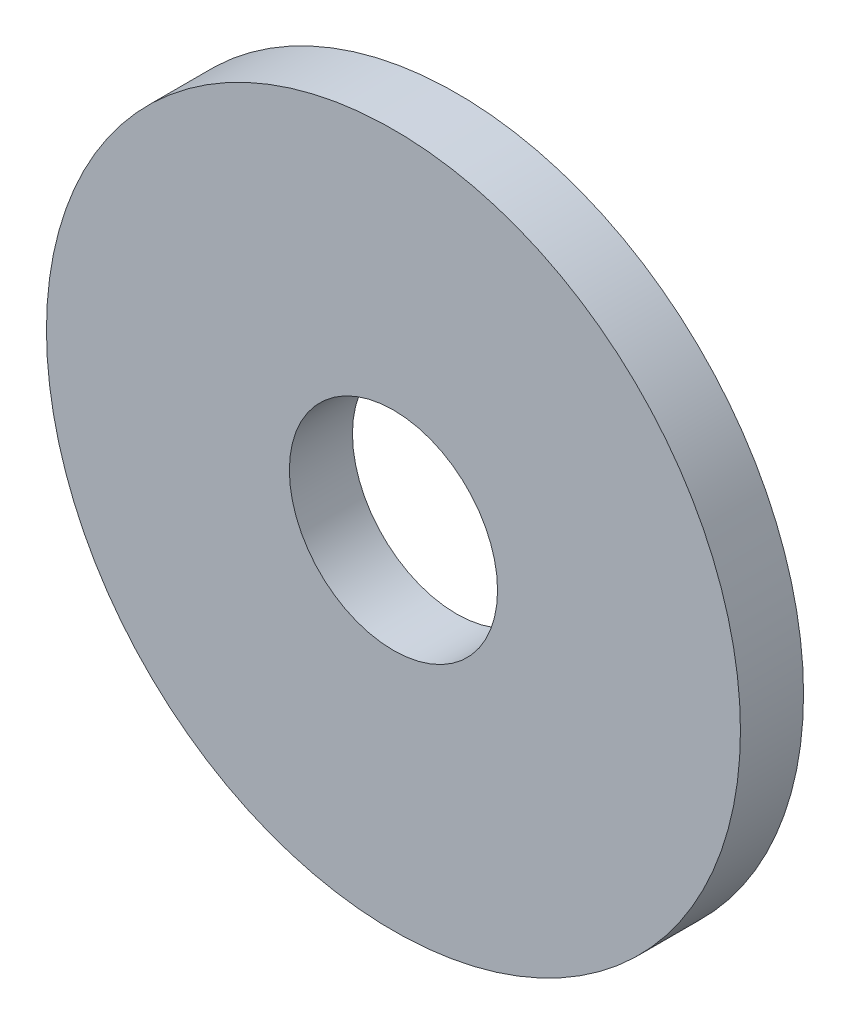
ISO-10303-21;
HEADER;
FILE_DESCRIPTION(('STEP AP214'),'2;1');
FILE_NAME('part.step','',(''),(''),'','','');
FILE_SCHEMA(('AUTOMOTIVE_DESIGN { 1 0 10303 214 1 1 1 1 }'));
ENDSEC;
DATA;
#1=APPLICATION_CONTEXT('core data for automotive mechanical design processes');
#2=APPLICATION_PROTOCOL_DEFINITION('international standard','automotive_design',2000,#1);
#3=PRODUCT_CONTEXT('',#1,'mechanical');
#4=PRODUCT('Part','Part','',(#3));
#5=PRODUCT_RELATED_PRODUCT_CATEGORY('part','',(#4));
#6=PRODUCT_DEFINITION_FORMATION('','',#4);
#7=PRODUCT_DEFINITION_CONTEXT('part definition',#1,'design');
#8=PRODUCT_DEFINITION('design','',#6,#7);
#9=PRODUCT_DEFINITION_SHAPE('','',#8);
#10=(LENGTH_UNIT() NAMED_UNIT(*) SI_UNIT(.MILLI.,.METRE.));
#11=(NAMED_UNIT(*) PLANE_ANGLE_UNIT() SI_UNIT($,.RADIAN.));
#12=(NAMED_UNIT(*) SI_UNIT($,.STERADIAN.) SOLID_ANGLE_UNIT());
#13=UNCERTAINTY_MEASURE_WITH_UNIT(LENGTH_MEASURE(1.E-05),#10,'distance_accuracy_value','');
#14=(GEOMETRIC_REPRESENTATION_CONTEXT(3) GLOBAL_UNCERTAINTY_ASSIGNED_CONTEXT((#13)) GLOBAL_UNIT_ASSIGNED_CONTEXT((#10,
#11,#12)) REPRESENTATION_CONTEXT('',''));
#15=CARTESIAN_POINT('',(0.,0.,0.));
#16=DIRECTION('',(0.,0.,1.));
#17=DIRECTION('',(1.,0.,0.));
#18=AXIS2_PLACEMENT_3D('',#15,#16,#17);
#19=CARTESIAN_POINT('',(0.,0.,1.));
#20=DIRECTION('',(0.,0.,1.));
#21=DIRECTION('',(1.,0.,0.));
#22=AXIS2_PLACEMENT_3D('',#19,#20,#21);
#23=PLANE('',#22);
#24=CARTESIAN_POINT('',(0.,0.,1.));
#25=DIRECTION('',(0.,0.,1.));
#26=DIRECTION('',(1.,0.,0.));
#27=AXIS2_PLACEMENT_3D('',#24,#25,#26);
#28=CIRCLE('',#27,11.);
#29=CARTESIAN_POINT('',(11.,0.,1.));
#30=VERTEX_POINT('',#29);
#31=EDGE_CURVE('E10',#30,#30,#28,.T.);
#32=ORIENTED_EDGE('',*,*,#31,.T.);
#33=EDGE_LOOP('',(#32));
#34=FACE_BOUND('',#33,.T.);
#35=CARTESIAN_POINT('',(0.,0.,1.));
#36=DIRECTION('',(0.,0.,1.));
#37=DIRECTION('',(1.,0.,0.));
#38=AXIS2_PLACEMENT_3D('',#35,#36,#37);
#39=CIRCLE('',#38,3.3);
#40=CARTESIAN_POINT('',(3.3,0.,1.));
#41=VERTEX_POINT('',#40);
#42=EDGE_CURVE('E52',#41,#41,#39,.T.);
#43=ORIENTED_EDGE('',*,*,#42,.F.);
#44=EDGE_LOOP('',(#43));
#45=FACE_BOUND('',#44,.T.);
#46=ADVANCED_FACE('F39',(#34,#45),#23,.T.);
#47=CARTESIAN_POINT('',(0.,0.,-1.));
#48=DIRECTION('',(0.,0.,1.));
#49=DIRECTION('',(1.,0.,0.));
#50=AXIS2_PLACEMENT_3D('',#47,#48,#49);
#51=PLANE('',#50);
#52=CARTESIAN_POINT('',(0.,0.,-1.));
#53=DIRECTION('',(0.,0.,1.));
#54=DIRECTION('',(1.,0.,0.));
#55=AXIS2_PLACEMENT_3D('',#52,#53,#54);
#56=CIRCLE('',#55,11.);
#57=CARTESIAN_POINT('',(11.,0.,-1.));
#58=VERTEX_POINT('',#57);
#59=EDGE_CURVE('E43',#58,#58,#56,.T.);
#60=ORIENTED_EDGE('',*,*,#59,.F.);
#61=EDGE_LOOP('',(#60));
#62=FACE_BOUND('',#61,.T.);
#63=CARTESIAN_POINT('',(0.,0.,-1.));
#64=DIRECTION('',(0.,0.,1.));
#65=DIRECTION('',(1.,0.,0.));
#66=AXIS2_PLACEMENT_3D('',#63,#64,#65);
#67=CIRCLE('',#66,3.3);
#68=CARTESIAN_POINT('',(3.3,0.,-1.));
#69=VERTEX_POINT('',#68);
#70=EDGE_CURVE('E54',#69,#69,#67,.T.);
#71=ORIENTED_EDGE('',*,*,#70,.T.);
#72=EDGE_LOOP('',(#71));
#73=FACE_BOUND('',#72,.T.);
#74=ADVANCED_FACE('F66',(#62,#73),#51,.F.);
#75=CARTESIAN_POINT('',(0.,0.,1.));
#76=DIRECTION('',(0.,0.,-1.));
#77=DIRECTION('',(-1.,0.,0.));
#78=AXIS2_PLACEMENT_3D('',#75,#76,#77);
#79=CYLINDRICAL_SURFACE('',#78,11.);
#80=ORIENTED_EDGE('',*,*,#31,.F.);
#81=EDGE_LOOP('',(#80));
#82=FACE_BOUND('',#81,.T.);
#83=ORIENTED_EDGE('',*,*,#59,.T.);
#84=EDGE_LOOP('',(#83));
#85=FACE_BOUND('',#84,.T.);
#86=ADVANCED_FACE('F41',(#82,#85),#79,.T.);
#87=CARTESIAN_POINT('',(0.,0.,1.));
#88=DIRECTION('',(0.,0.,-1.));
#89=DIRECTION('',(-1.,0.,0.));
#90=AXIS2_PLACEMENT_3D('',#87,#88,#89);
#91=CYLINDRICAL_SURFACE('',#90,3.3);
#92=ORIENTED_EDGE('',*,*,#42,.T.);
#93=EDGE_LOOP('',(#92));
#94=FACE_BOUND('',#93,.T.);
#95=ORIENTED_EDGE('',*,*,#70,.F.);
#96=EDGE_LOOP('',(#95));
#97=FACE_BOUND('',#96,.T.);
#98=ADVANCED_FACE('F62',(#94,#97),#91,.F.);
#99=CLOSED_SHELL('',(#46,#74,#86,#98));
#100=MANIFOLD_SOLID_BREP('B2',#99);
#101=ADVANCED_BREP_SHAPE_REPRESENTATION('',(#18,#100),#14);
#102=SHAPE_DEFINITION_REPRESENTATION(#9,#101);
ENDSEC;
END-ISO-10303-21;
